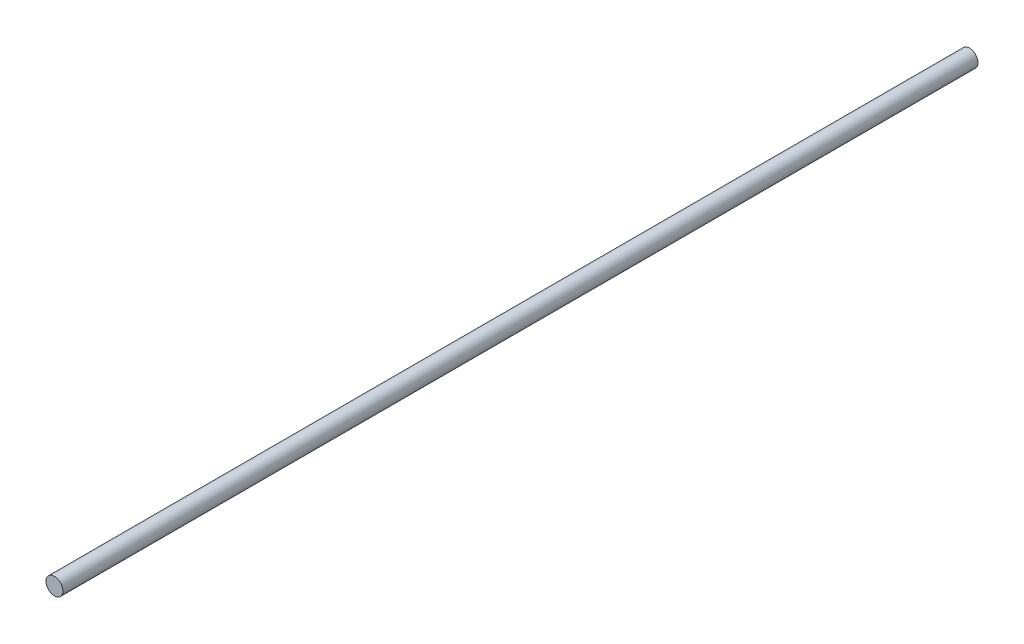
ISO-10303-21;
HEADER;
FILE_DESCRIPTION(('STEP AP214'),'2;1');
FILE_NAME('part.step','',(''),(''),'','','');
FILE_SCHEMA(('AUTOMOTIVE_DESIGN { 1 0 10303 214 1 1 1 1 }'));
ENDSEC;
DATA;
#1=APPLICATION_CONTEXT('core data for automotive mechanical design processes');
#2=APPLICATION_PROTOCOL_DEFINITION('international standard','automotive_design',2000,#1);
#3=PRODUCT_CONTEXT('',#1,'mechanical');
#4=PRODUCT('Part','Part','',(#3));
#5=PRODUCT_RELATED_PRODUCT_CATEGORY('part','',(#4));
#6=PRODUCT_DEFINITION_FORMATION('','',#4);
#7=PRODUCT_DEFINITION_CONTEXT('part definition',#1,'design');
#8=PRODUCT_DEFINITION('design','',#6,#7);
#9=PRODUCT_DEFINITION_SHAPE('','',#8);
#10=(LENGTH_UNIT() NAMED_UNIT(*) SI_UNIT(.MILLI.,.METRE.));
#11=(NAMED_UNIT(*) PLANE_ANGLE_UNIT() SI_UNIT($,.RADIAN.));
#12=(NAMED_UNIT(*) SI_UNIT($,.STERADIAN.) SOLID_ANGLE_UNIT());
#13=UNCERTAINTY_MEASURE_WITH_UNIT(LENGTH_MEASURE(1.E-05),#10,'distance_accuracy_value','');
#14=(GEOMETRIC_REPRESENTATION_CONTEXT(3) GLOBAL_UNCERTAINTY_ASSIGNED_CONTEXT((#13)) GLOBAL_UNIT_ASSIGNED_CONTEXT((#10,
#11,#12)) REPRESENTATION_CONTEXT('',''));
#15=CARTESIAN_POINT('',(0.,0.,0.));
#16=DIRECTION('',(0.,0.,1.));
#17=DIRECTION('',(1.,0.,0.));
#18=AXIS2_PLACEMENT_3D('',#15,#16,#17);
#19=CARTESIAN_POINT('',(0.,0.,270.));
#20=DIRECTION('',(0.,0.,-1.));
#21=DIRECTION('',(-1.,0.,0.));
#22=AXIS2_PLACEMENT_3D('',#19,#20,#21);
#23=CYLINDRICAL_SURFACE('',#22,2.5);
#24=CARTESIAN_POINT('',(0.,0.,270.));
#25=DIRECTION('',(0.,0.,1.));
#26=DIRECTION('',(1.,0.,0.));
#27=AXIS2_PLACEMENT_3D('',#24,#25,#26);
#28=CIRCLE('',#27,2.5);
#29=CARTESIAN_POINT('',(2.5,0.,270.));
#30=VERTEX_POINT('',#29);
#31=EDGE_CURVE('E10',#30,#30,#28,.T.);
#32=ORIENTED_EDGE('',*,*,#31,.F.);
#33=EDGE_LOOP('',(#32));
#34=FACE_BOUND('',#33,.T.);
#35=CARTESIAN_POINT('',(0.,0.,0.));
#36=DIRECTION('',(0.,0.,1.));
#37=DIRECTION('',(1.,0.,0.));
#38=AXIS2_PLACEMENT_3D('',#35,#36,#37);
#39=CIRCLE('',#38,2.5);
#40=CARTESIAN_POINT('',(2.5,0.,0.));
#41=VERTEX_POINT('',#40);
#42=EDGE_CURVE('E34',#41,#41,#39,.T.);
#43=ORIENTED_EDGE('',*,*,#42,.T.);
#44=EDGE_LOOP('',(#43));
#45=FACE_BOUND('',#44,.T.);
#46=ADVANCED_FACE('F31',(#34,#45),#23,.T.);
#47=CARTESIAN_POINT('',(0.,0.,270.));
#48=DIRECTION('',(0.,0.,1.));
#49=DIRECTION('',(1.,0.,0.));
#50=AXIS2_PLACEMENT_3D('',#47,#48,#49);
#51=PLANE('',#50);
#52=ORIENTED_EDGE('',*,*,#31,.T.);
#53=EDGE_LOOP('',(#52));
#54=FACE_BOUND('',#53,.T.);
#55=ADVANCED_FACE('F46',(#54),#51,.T.);
#56=CARTESIAN_POINT('',(0.,0.,0.));
#57=DIRECTION('',(0.,0.,1.));
#58=DIRECTION('',(1.,0.,0.));
#59=AXIS2_PLACEMENT_3D('',#56,#57,#58);
#60=PLANE('',#59);
#61=ORIENTED_EDGE('',*,*,#42,.F.);
#62=EDGE_LOOP('',(#61));
#63=FACE_BOUND('',#62,.T.);
#64=ADVANCED_FACE('F44',(#63),#60,.F.);
#65=CLOSED_SHELL('',(#46,#55,#64));
#66=MANIFOLD_SOLID_BREP('B2',#65);
#67=ADVANCED_BREP_SHAPE_REPRESENTATION('',(#18,#66),#14);
#68=SHAPE_DEFINITION_REPRESENTATION(#9,#67);
ENDSEC;
END-ISO-10303-21;
